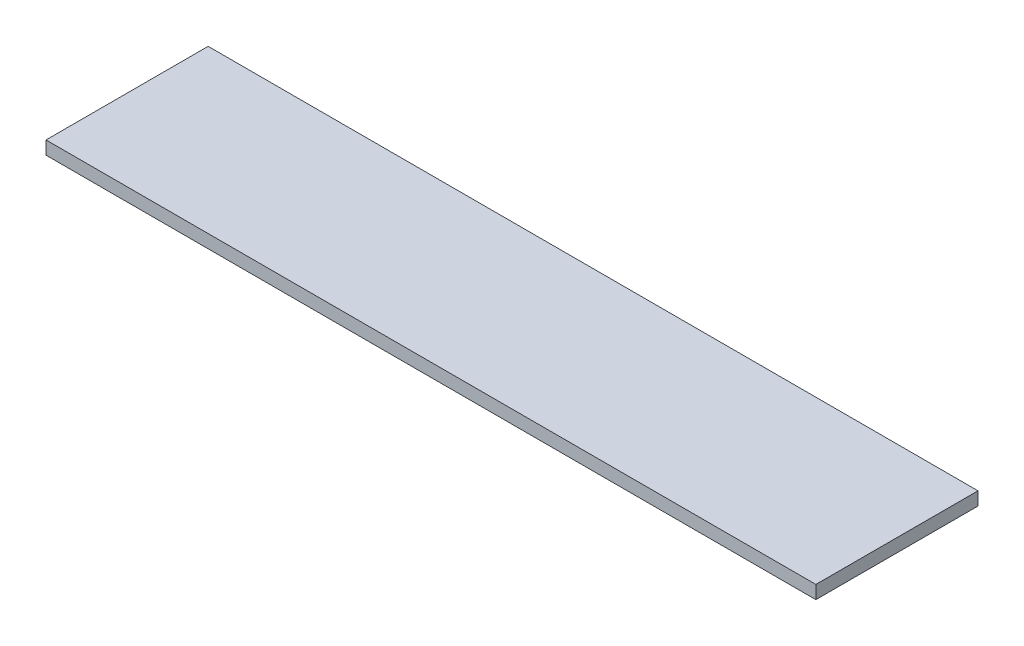
ISO-10303-21;
HEADER;
FILE_DESCRIPTION(('STEP AP214'),'2;1');
FILE_NAME('part.step','',(''),(''),'','','');
FILE_SCHEMA(('AUTOMOTIVE_DESIGN { 1 0 10303 214 1 1 1 1 }'));
ENDSEC;
DATA;
#1=APPLICATION_CONTEXT('core data for automotive mechanical design processes');
#2=APPLICATION_PROTOCOL_DEFINITION('international standard','automotive_design',2000,#1);
#3=PRODUCT_CONTEXT('',#1,'mechanical');
#4=PRODUCT('Part','Part','',(#3));
#5=PRODUCT_RELATED_PRODUCT_CATEGORY('part','',(#4));
#6=PRODUCT_DEFINITION_FORMATION('','',#4);
#7=PRODUCT_DEFINITION_CONTEXT('part definition',#1,'design');
#8=PRODUCT_DEFINITION('design','',#6,#7);
#9=PRODUCT_DEFINITION_SHAPE('','',#8);
#10=(LENGTH_UNIT() NAMED_UNIT(*) SI_UNIT(.MILLI.,.METRE.));
#11=(NAMED_UNIT(*) PLANE_ANGLE_UNIT() SI_UNIT($,.RADIAN.));
#12=(NAMED_UNIT(*) SI_UNIT($,.STERADIAN.) SOLID_ANGLE_UNIT());
#13=UNCERTAINTY_MEASURE_WITH_UNIT(LENGTH_MEASURE(1.E-05),#10,'distance_accuracy_value','');
#14=(GEOMETRIC_REPRESENTATION_CONTEXT(3) GLOBAL_UNCERTAINTY_ASSIGNED_CONTEXT((#13)) GLOBAL_UNIT_ASSIGNED_CONTEXT((#10,
#11,#12)) REPRESENTATION_CONTEXT('',''));
#15=CARTESIAN_POINT('',(0.,0.,0.));
#16=DIRECTION('',(0.,0.,1.));
#17=DIRECTION('',(1.,0.,0.));
#18=AXIS2_PLACEMENT_3D('',#15,#16,#17);
#19=CARTESIAN_POINT('',(-203.128714472294,28.3386479612977,120.));
#20=DIRECTION('',(1.,0.,0.));
#21=DIRECTION('',(0.,0.,-1.));
#22=AXIS2_PLACEMENT_3D('',#19,#20,#21);
#23=PLANE('',#22);
#24=DIRECTION('',(0.,-1.,0.));
#25=VECTOR('',#24,1.);
#26=CARTESIAN_POINT('',(-203.128714472294,28.3386479612977,0.));
#27=LINE('',#26,#25);
#28=CARTESIAN_POINT('',(-203.128714472294,28.3386479612977,0.));
#29=VERTEX_POINT('',#28);
#30=CARTESIAN_POINT('',(-203.128714472294,18.5565488849083,0.));
#31=VERTEX_POINT('',#30);
#32=EDGE_CURVE('E98',#29,#31,#27,.T.);
#33=ORIENTED_EDGE('',*,*,#32,.T.);
#34=DIRECTION('',(0.,0.,-1.));
#35=VECTOR('',#34,1.);
#36=CARTESIAN_POINT('',(-203.128714472294,18.5565488849083,120.));
#37=LINE('',#36,#35);
#38=CARTESIAN_POINT('',(-203.128714472294,18.5565488849083,120.));
#39=VERTEX_POINT('',#38);
#40=EDGE_CURVE('E11',#39,#31,#37,.T.);
#41=ORIENTED_EDGE('',*,*,#40,.F.);
#42=DIRECTION('',(0.,-1.,0.));
#43=VECTOR('',#42,1.);
#44=CARTESIAN_POINT('',(-203.128714472294,28.3386479612977,120.));
#45=LINE('',#44,#43);
#46=CARTESIAN_POINT('',(-203.128714472294,28.3386479612977,120.));
#47=VERTEX_POINT('',#46);
#48=EDGE_CURVE('E86',#47,#39,#45,.T.);
#49=ORIENTED_EDGE('',*,*,#48,.F.);
#50=DIRECTION('',(0.,0.,-1.));
#51=VECTOR('',#50,1.);
#52=CARTESIAN_POINT('',(-203.128714472294,28.3386479612977,120.));
#53=LINE('',#52,#51);
#54=EDGE_CURVE('E94',#47,#29,#53,.T.);
#55=ORIENTED_EDGE('',*,*,#54,.T.);
#56=EDGE_LOOP('',(#33,#41,#49,#55));
#57=FACE_BOUND('',#56,.T.);
#58=ADVANCED_FACE('F35',(#57),#23,.F.);
#59=CARTESIAN_POINT('',(-203.128714472294,18.5565488849083,120.));
#60=DIRECTION('',(0.,1.,0.));
#61=DIRECTION('',(0.,0.,1.));
#62=AXIS2_PLACEMENT_3D('',#59,#60,#61);
#63=PLANE('',#62);
#64=DIRECTION('',(1.,0.,0.));
#65=VECTOR('',#64,1.);
#66=CARTESIAN_POINT('',(-203.128714472294,18.5565488849083,0.));
#67=LINE('',#66,#65);
#68=CARTESIAN_POINT('',(366.641934655256,18.5565488849083,0.));
#69=VERTEX_POINT('',#68);
#70=EDGE_CURVE('E90',#31,#69,#67,.T.);
#71=ORIENTED_EDGE('',*,*,#70,.T.);
#72=DIRECTION('',(0.,0.,-1.));
#73=VECTOR('',#72,1.);
#74=CARTESIAN_POINT('',(366.641934655256,18.5565488849083,120.));
#75=LINE('',#74,#73);
#76=CARTESIAN_POINT('',(366.641934655256,18.5565488849083,120.));
#77=VERTEX_POINT('',#76);
#78=EDGE_CURVE('E43',#77,#69,#75,.T.);
#79=ORIENTED_EDGE('',*,*,#78,.F.);
#80=DIRECTION('',(1.,0.,0.));
#81=VECTOR('',#80,1.);
#82=CARTESIAN_POINT('',(-203.128714472294,18.5565488849083,120.));
#83=LINE('',#82,#81);
#84=EDGE_CURVE('E81',#39,#77,#83,.T.);
#85=ORIENTED_EDGE('',*,*,#84,.F.);
#86=ORIENTED_EDGE('',*,*,#40,.T.);
#87=EDGE_LOOP('',(#71,#79,#85,#86));
#88=FACE_BOUND('',#87,.T.);
#89=ADVANCED_FACE('F89',(#88),#63,.F.);
#90=CARTESIAN_POINT('',(366.641934655256,28.3386479612977,120.));
#91=DIRECTION('',(-1.,0.,0.));
#92=DIRECTION('',(0.,0.,1.));
#93=AXIS2_PLACEMENT_3D('',#90,#91,#92);
#94=PLANE('',#93);
#95=DIRECTION('',(0.,1.,0.));
#96=VECTOR('',#95,1.);
#97=CARTESIAN_POINT('',(366.641934655256,28.3386479612977,0.));
#98=LINE('',#97,#96);
#99=CARTESIAN_POINT('',(366.641934655256,28.3386479612977,0.));
#100=VERTEX_POINT('',#99);
#101=EDGE_CURVE('E68',#69,#100,#98,.T.);
#102=ORIENTED_EDGE('',*,*,#101,.T.);
#103=DIRECTION('',(0.,0.,-1.));
#104=VECTOR('',#103,1.);
#105=CARTESIAN_POINT('',(366.641934655256,28.3386479612977,120.));
#106=LINE('',#105,#104);
#107=CARTESIAN_POINT('',(366.641934655256,28.3386479612977,120.));
#108=VERTEX_POINT('',#107);
#109=EDGE_CURVE('E91',#108,#100,#106,.T.);
#110=ORIENTED_EDGE('',*,*,#109,.F.);
#111=DIRECTION('',(0.,1.,0.));
#112=VECTOR('',#111,1.);
#113=CARTESIAN_POINT('',(366.641934655256,28.3386479612977,120.));
#114=LINE('',#113,#112);
#115=EDGE_CURVE('E84',#77,#108,#114,.T.);
#116=ORIENTED_EDGE('',*,*,#115,.F.);
#117=ORIENTED_EDGE('',*,*,#78,.T.);
#118=EDGE_LOOP('',(#102,#110,#116,#117));
#119=FACE_BOUND('',#118,.T.);
#120=ADVANCED_FACE('F92',(#119),#94,.F.);
#121=CARTESIAN_POINT('',(-203.128714472294,28.3386479612977,120.));
#122=DIRECTION('',(0.,-1.,0.));
#123=DIRECTION('',(0.,0.,-1.));
#124=AXIS2_PLACEMENT_3D('',#121,#122,#123);
#125=PLANE('',#124);
#126=DIRECTION('',(-1.,0.,0.));
#127=VECTOR('',#126,1.);
#128=CARTESIAN_POINT('',(-203.128714472294,28.3386479612977,0.));
#129=LINE('',#128,#127);
#130=EDGE_CURVE('E74',#100,#29,#129,.T.);
#131=ORIENTED_EDGE('',*,*,#130,.T.);
#132=ORIENTED_EDGE('',*,*,#54,.F.);
#133=DIRECTION('',(-1.,0.,0.));
#134=VECTOR('',#133,1.);
#135=CARTESIAN_POINT('',(-203.128714472294,28.3386479612977,120.));
#136=LINE('',#135,#134);
#137=EDGE_CURVE('E51',#108,#47,#136,.T.);
#138=ORIENTED_EDGE('',*,*,#137,.F.);
#139=ORIENTED_EDGE('',*,*,#109,.T.);
#140=EDGE_LOOP('',(#131,#132,#138,#139));
#141=FACE_BOUND('',#140,.T.);
#142=ADVANCED_FACE('F105',(#141),#125,.F.);
#143=CARTESIAN_POINT('',(0.,0.,120.));
#144=DIRECTION('',(0.,0.,1.));
#145=DIRECTION('',(1.,0.,0.));
#146=AXIS2_PLACEMENT_3D('',#143,#144,#145);
#147=PLANE('',#146);
#148=ORIENTED_EDGE('',*,*,#48,.T.);
#149=ORIENTED_EDGE('',*,*,#84,.T.);
#150=ORIENTED_EDGE('',*,*,#115,.T.);
#151=ORIENTED_EDGE('',*,*,#137,.T.);
#152=EDGE_LOOP('',(#148,#149,#150,#151));
#153=FACE_BOUND('',#152,.T.);
#154=ADVANCED_FACE('F82',(#153),#147,.T.);
#155=CARTESIAN_POINT('',(0.,0.,0.));
#156=DIRECTION('',(0.,0.,1.));
#157=DIRECTION('',(1.,0.,0.));
#158=AXIS2_PLACEMENT_3D('',#155,#156,#157);
#159=PLANE('',#158);
#160=ORIENTED_EDGE('',*,*,#32,.F.);
#161=ORIENTED_EDGE('',*,*,#130,.F.);
#162=ORIENTED_EDGE('',*,*,#101,.F.);
#163=ORIENTED_EDGE('',*,*,#70,.F.);
#164=EDGE_LOOP('',(#160,#161,#162,#163));
#165=FACE_BOUND('',#164,.T.);
#166=ADVANCED_FACE('F108',(#165),#159,.F.);
#167=CLOSED_SHELL('',(#58,#89,#120,#142,#154,#166));
#168=MANIFOLD_SOLID_BREP('B2',#167);
#169=ADVANCED_BREP_SHAPE_REPRESENTATION('',(#18,#168),#14);
#170=SHAPE_DEFINITION_REPRESENTATION(#9,#169);
ENDSEC;
END-ISO-10303-21;
